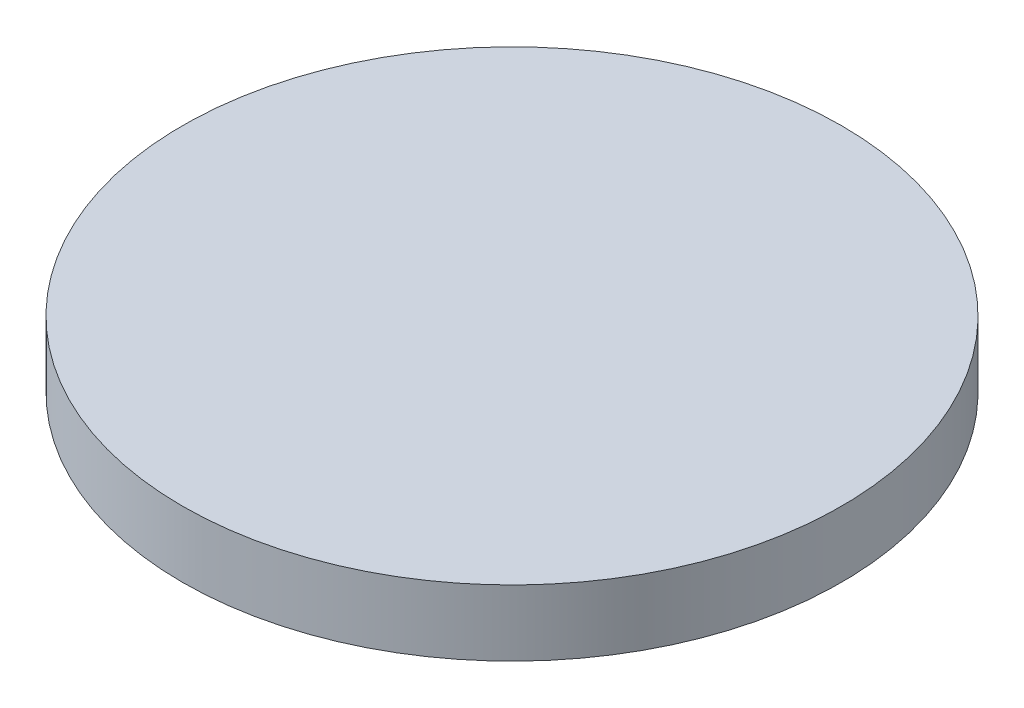
ISO-10303-21;
HEADER;
FILE_DESCRIPTION(('STEP AP214'),'2;1');
FILE_NAME('part.step','',(''),(''),'','','');
FILE_SCHEMA(('AUTOMOTIVE_DESIGN { 1 0 10303 214 1 1 1 1 }'));
ENDSEC;
DATA;
#1=APPLICATION_CONTEXT('core data for automotive mechanical design processes');
#2=APPLICATION_PROTOCOL_DEFINITION('international standard','automotive_design',2000,#1);
#3=PRODUCT_CONTEXT('',#1,'mechanical');
#4=PRODUCT('Part','Part','',(#3));
#5=PRODUCT_RELATED_PRODUCT_CATEGORY('part','',(#4));
#6=PRODUCT_DEFINITION_FORMATION('','',#4);
#7=PRODUCT_DEFINITION_CONTEXT('part definition',#1,'design');
#8=PRODUCT_DEFINITION('design','',#6,#7);
#9=PRODUCT_DEFINITION_SHAPE('','',#8);
#10=(LENGTH_UNIT() NAMED_UNIT(*) SI_UNIT(.MILLI.,.METRE.));
#11=(NAMED_UNIT(*) PLANE_ANGLE_UNIT() SI_UNIT($,.RADIAN.));
#12=(NAMED_UNIT(*) SI_UNIT($,.STERADIAN.) SOLID_ANGLE_UNIT());
#13=UNCERTAINTY_MEASURE_WITH_UNIT(LENGTH_MEASURE(1.E-05),#10,'distance_accuracy_value','');
#14=(GEOMETRIC_REPRESENTATION_CONTEXT(3) GLOBAL_UNCERTAINTY_ASSIGNED_CONTEXT((#13)) GLOBAL_UNIT_ASSIGNED_CONTEXT((#10,
#11,#12)) REPRESENTATION_CONTEXT('',''));
#15=CARTESIAN_POINT('',(0.,0.,0.));
#16=DIRECTION('',(0.,0.,1.));
#17=DIRECTION('',(1.,0.,0.));
#18=AXIS2_PLACEMENT_3D('',#15,#16,#17);
#19=CARTESIAN_POINT('',(0.,1.98373999999998,0.));
#20=DIRECTION('',(0.,-1.,0.));
#21=DIRECTION('',(0.,0.,-1.));
#22=AXIS2_PLACEMENT_3D('',#19,#20,#21);
#23=CYLINDRICAL_SURFACE('',#22,9.90599999999997);
#24=CARTESIAN_POINT('',(0.,1.98373999999998,0.));
#25=DIRECTION('',(0.,-1.,0.));
#26=DIRECTION('',(0.,0.,-1.));
#27=AXIS2_PLACEMENT_3D('',#24,#25,#26);
#28=CIRCLE('',#27,9.90599999999997);
#29=CARTESIAN_POINT('',(0.,1.98373999999998,-9.90599999999997));
#30=VERTEX_POINT('',#29);
#31=EDGE_CURVE('E10',#30,#30,#28,.T.);
#32=ORIENTED_EDGE('',*,*,#31,.T.);
#33=EDGE_LOOP('',(#32));
#34=FACE_BOUND('',#33,.T.);
#35=CARTESIAN_POINT('',(0.,0.,0.));
#36=DIRECTION('',(0.,-1.,0.));
#37=DIRECTION('',(0.,0.,-1.));
#38=AXIS2_PLACEMENT_3D('',#35,#36,#37);
#39=CIRCLE('',#38,9.90599999999997);
#40=CARTESIAN_POINT('',(0.,0.,-9.90599999999997));
#41=VERTEX_POINT('',#40);
#42=EDGE_CURVE('E37',#41,#41,#39,.T.);
#43=ORIENTED_EDGE('',*,*,#42,.F.);
#44=EDGE_LOOP('',(#43));
#45=FACE_BOUND('',#44,.T.);
#46=ADVANCED_FACE('F31',(#34,#45),#23,.T.);
#47=CARTESIAN_POINT('',(9.90599999999997,1.98373999999998,0.));
#48=DIRECTION('',(0.,1.,0.));
#49=DIRECTION('',(0.,0.,1.));
#50=AXIS2_PLACEMENT_3D('',#47,#48,#49);
#51=PLANE('',#50);
#52=ORIENTED_EDGE('',*,*,#31,.F.);
#53=EDGE_LOOP('',(#52));
#54=FACE_BOUND('',#53,.T.);
#55=ADVANCED_FACE('F46',(#54),#51,.T.);
#56=CARTESIAN_POINT('',(0.,0.,0.));
#57=DIRECTION('',(0.,-1.,0.));
#58=DIRECTION('',(0.,0.,-1.));
#59=AXIS2_PLACEMENT_3D('',#56,#57,#58);
#60=PLANE('',#59);
#61=ORIENTED_EDGE('',*,*,#42,.T.);
#62=EDGE_LOOP('',(#61));
#63=FACE_BOUND('',#62,.T.);
#64=ADVANCED_FACE('F43',(#63),#60,.T.);
#65=CLOSED_SHELL('',(#46,#55,#64));
#66=MANIFOLD_SOLID_BREP('B2',#65);
#67=ADVANCED_BREP_SHAPE_REPRESENTATION('',(#18,#66),#14);
#68=SHAPE_DEFINITION_REPRESENTATION(#9,#67);
ENDSEC;
END-ISO-10303-21;
